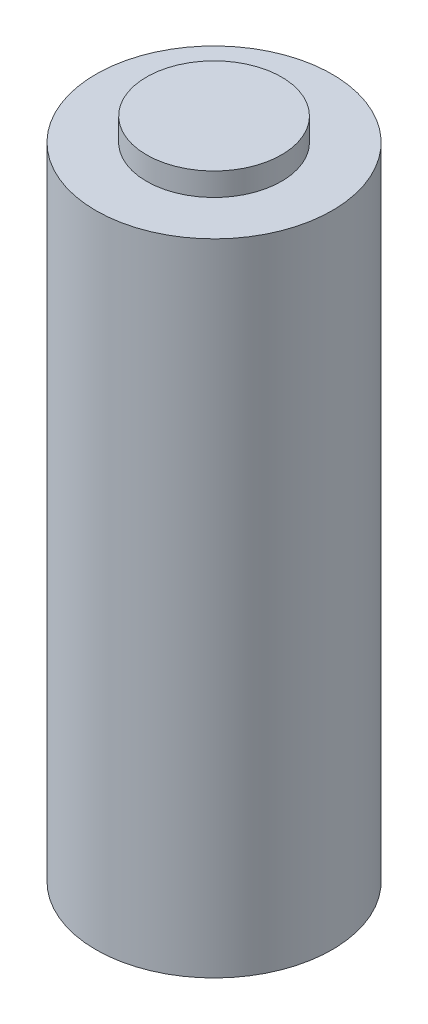
ISO-10303-21;
HEADER;
FILE_DESCRIPTION(('STEP AP214'),'2;1');
FILE_NAME('part.step','',(''),(''),'','','');
FILE_SCHEMA(('AUTOMOTIVE_DESIGN { 1 0 10303 214 1 1 1 1 }'));
ENDSEC;
DATA;
#1=APPLICATION_CONTEXT('core data for automotive mechanical design processes');
#2=APPLICATION_PROTOCOL_DEFINITION('international standard','automotive_design',2000,#1);
#3=PRODUCT_CONTEXT('',#1,'mechanical');
#4=PRODUCT('Part','Part','',(#3));
#5=PRODUCT_RELATED_PRODUCT_CATEGORY('part','',(#4));
#6=PRODUCT_DEFINITION_FORMATION('','',#4);
#7=PRODUCT_DEFINITION_CONTEXT('part definition',#1,'design');
#8=PRODUCT_DEFINITION('design','',#6,#7);
#9=PRODUCT_DEFINITION_SHAPE('','',#8);
#10=(LENGTH_UNIT() NAMED_UNIT(*) SI_UNIT(.MILLI.,.METRE.));
#11=(NAMED_UNIT(*) PLANE_ANGLE_UNIT() SI_UNIT($,.RADIAN.));
#12=(NAMED_UNIT(*) SI_UNIT($,.STERADIAN.) SOLID_ANGLE_UNIT());
#13=UNCERTAINTY_MEASURE_WITH_UNIT(LENGTH_MEASURE(1.E-05),#10,'distance_accuracy_value','');
#14=(GEOMETRIC_REPRESENTATION_CONTEXT(3) GLOBAL_UNCERTAINTY_ASSIGNED_CONTEXT((#13)) GLOBAL_UNIT_ASSIGNED_CONTEXT((#10,
#11,#12)) REPRESENTATION_CONTEXT('',''));
#15=CARTESIAN_POINT('',(0.,0.,0.));
#16=DIRECTION('',(0.,0.,1.));
#17=DIRECTION('',(1.,0.,0.));
#18=AXIS2_PLACEMENT_3D('',#15,#16,#17);
#19=CARTESIAN_POINT('',(0.,28.9,0.));
#20=DIRECTION('',(0.,-1.,0.));
#21=DIRECTION('',(0.,0.,-1.));
#22=AXIS2_PLACEMENT_3D('',#19,#20,#21);
#23=CYLINDRICAL_SURFACE('',#22,5.15);
#24=CARTESIAN_POINT('',(0.,0.,0.));
#25=DIRECTION('',(0.,1.,0.));
#26=DIRECTION('',(0.,0.,1.));
#27=AXIS2_PLACEMENT_3D('',#24,#25,#26);
#28=CIRCLE('',#27,5.15);
#29=CARTESIAN_POINT('',(0.,0.,5.15));
#30=VERTEX_POINT('',#29);
#31=EDGE_CURVE('E10',#30,#30,#28,.T.);
#32=ORIENTED_EDGE('',*,*,#31,.T.);
#33=EDGE_LOOP('',(#32));
#34=FACE_BOUND('',#33,.T.);
#35=CARTESIAN_POINT('',(0.,27.9,0.));
#36=DIRECTION('',(0.,1.,0.));
#37=DIRECTION('',(0.,0.,1.));
#38=AXIS2_PLACEMENT_3D('',#35,#36,#37);
#39=CIRCLE('',#38,5.15);
#40=CARTESIAN_POINT('',(0.,27.9,5.15));
#41=VERTEX_POINT('',#40);
#42=EDGE_CURVE('E49',#41,#41,#39,.T.);
#43=ORIENTED_EDGE('',*,*,#42,.F.);
#44=EDGE_LOOP('',(#43));
#45=FACE_BOUND('',#44,.T.);
#46=ADVANCED_FACE('F43',(#34,#45),#23,.T.);
#47=CARTESIAN_POINT('',(0.,0.,0.));
#48=DIRECTION('',(0.,1.,0.));
#49=DIRECTION('',(0.,0.,1.));
#50=AXIS2_PLACEMENT_3D('',#47,#48,#49);
#51=PLANE('',#50);
#52=ORIENTED_EDGE('',*,*,#31,.F.);
#53=EDGE_LOOP('',(#52));
#54=FACE_BOUND('',#53,.T.);
#55=ADVANCED_FACE('F75',(#54),#51,.F.);
#56=CARTESIAN_POINT('',(0.,27.9,0.));
#57=DIRECTION('',(0.,1.,0.));
#58=DIRECTION('',(0.,0.,1.));
#59=AXIS2_PLACEMENT_3D('',#56,#57,#58);
#60=PLANE('',#59);
#61=CARTESIAN_POINT('',(0.,27.9,0.));
#62=DIRECTION('',(0.,1.,0.));
#63=DIRECTION('',(0.,0.,1.));
#64=AXIS2_PLACEMENT_3D('',#61,#62,#63);
#65=CIRCLE('',#64,2.94181622909674);
#66=CARTESIAN_POINT('',(0.,27.9,2.94181622909674));
#67=VERTEX_POINT('',#66);
#68=EDGE_CURVE('E53',#67,#67,#65,.T.);
#69=ORIENTED_EDGE('',*,*,#68,.F.);
#70=EDGE_LOOP('',(#69));
#71=FACE_BOUND('',#70,.T.);
#72=ORIENTED_EDGE('',*,*,#42,.T.);
#73=EDGE_LOOP('',(#72));
#74=FACE_BOUND('',#73,.T.);
#75=ADVANCED_FACE('F67',(#71,#74),#60,.T.);
#76=CARTESIAN_POINT('',(0.,27.9,0.));
#77=DIRECTION('',(0.,1.,0.));
#78=DIRECTION('',(0.,0.,1.));
#79=AXIS2_PLACEMENT_3D('',#76,#77,#78);
#80=CYLINDRICAL_SURFACE('',#79,2.94181622909674);
#81=ORIENTED_EDGE('',*,*,#68,.T.);
#82=EDGE_LOOP('',(#81));
#83=FACE_BOUND('',#82,.T.);
#84=CARTESIAN_POINT('',(0.,28.9,0.));
#85=DIRECTION('',(0.,1.,0.));
#86=DIRECTION('',(0.,0.,1.));
#87=AXIS2_PLACEMENT_3D('',#84,#85,#86);
#88=CIRCLE('',#87,2.94181622909674);
#89=CARTESIAN_POINT('',(0.,28.9,2.94181622909674));
#90=VERTEX_POINT('',#89);
#91=EDGE_CURVE('E57',#90,#90,#88,.T.);
#92=ORIENTED_EDGE('',*,*,#91,.F.);
#93=EDGE_LOOP('',(#92));
#94=FACE_BOUND('',#93,.T.);
#95=ADVANCED_FACE('F65',(#83,#94),#80,.T.);
#96=CARTESIAN_POINT('',(0.,28.9,0.));
#97=DIRECTION('',(0.,1.,0.));
#98=DIRECTION('',(0.,0.,1.));
#99=AXIS2_PLACEMENT_3D('',#96,#97,#98);
#100=PLANE('',#99);
#101=ORIENTED_EDGE('',*,*,#91,.T.);
#102=EDGE_LOOP('',(#101));
#103=FACE_BOUND('',#102,.T.);
#104=ADVANCED_FACE('F63',(#103),#100,.T.);
#105=CLOSED_SHELL('',(#46,#55,#75,#95,#104));
#106=MANIFOLD_SOLID_BREP('B2',#105);
#107=ADVANCED_BREP_SHAPE_REPRESENTATION('',(#18,#106),#14);
#108=SHAPE_DEFINITION_REPRESENTATION(#9,#107);
ENDSEC;
END-ISO-10303-21;
